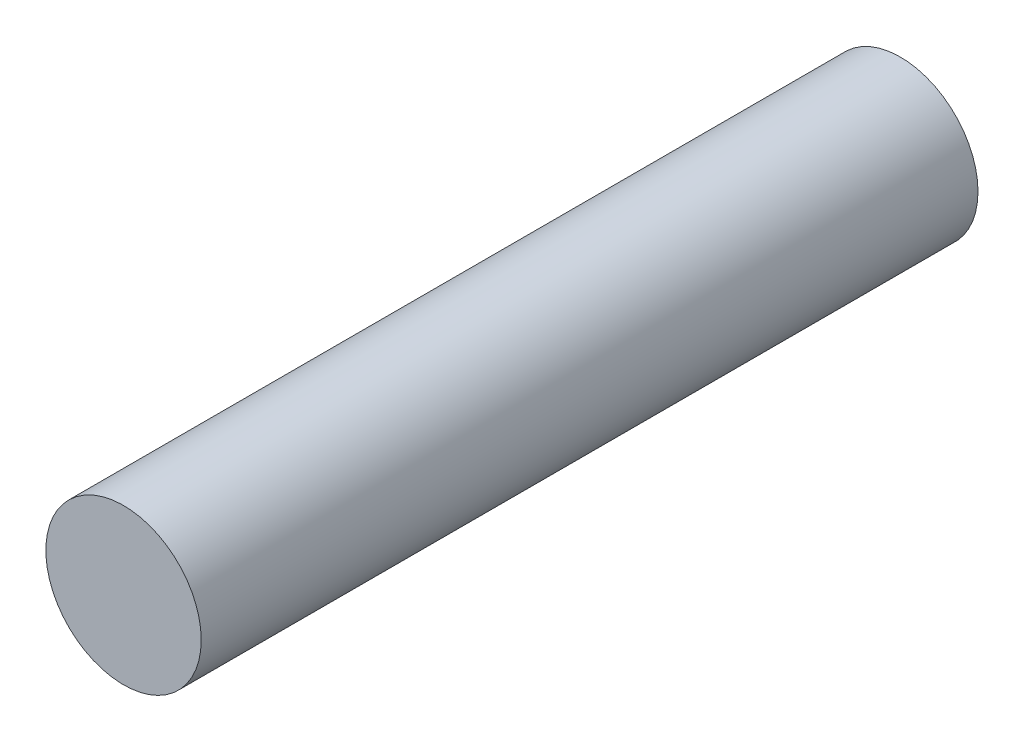
ISO-10303-21;
HEADER;
FILE_DESCRIPTION(('STEP AP214'),'2;1');
FILE_NAME('part.step','',(''),(''),'','','');
FILE_SCHEMA(('AUTOMOTIVE_DESIGN { 1 0 10303 214 1 1 1 1 }'));
ENDSEC;
DATA;
#1=APPLICATION_CONTEXT('core data for automotive mechanical design processes');
#2=APPLICATION_PROTOCOL_DEFINITION('international standard','automotive_design',2000,#1);
#3=PRODUCT_CONTEXT('',#1,'mechanical');
#4=PRODUCT('Part','Part','',(#3));
#5=PRODUCT_RELATED_PRODUCT_CATEGORY('part','',(#4));
#6=PRODUCT_DEFINITION_FORMATION('','',#4);
#7=PRODUCT_DEFINITION_CONTEXT('part definition',#1,'design');
#8=PRODUCT_DEFINITION('design','',#6,#7);
#9=PRODUCT_DEFINITION_SHAPE('','',#8);
#10=(LENGTH_UNIT() NAMED_UNIT(*) SI_UNIT(.MILLI.,.METRE.));
#11=(NAMED_UNIT(*) PLANE_ANGLE_UNIT() SI_UNIT($,.RADIAN.));
#12=(NAMED_UNIT(*) SI_UNIT($,.STERADIAN.) SOLID_ANGLE_UNIT());
#13=UNCERTAINTY_MEASURE_WITH_UNIT(LENGTH_MEASURE(1.E-05),#10,'distance_accuracy_value','');
#14=(GEOMETRIC_REPRESENTATION_CONTEXT(3) GLOBAL_UNCERTAINTY_ASSIGNED_CONTEXT((#13)) GLOBAL_UNIT_ASSIGNED_CONTEXT((#10,
#11,#12)) REPRESENTATION_CONTEXT('',''));
#15=CARTESIAN_POINT('',(0.,0.,0.));
#16=DIRECTION('',(0.,0.,1.));
#17=DIRECTION('',(1.,0.,0.));
#18=AXIS2_PLACEMENT_3D('',#15,#16,#17);
#19=CARTESIAN_POINT('',(0.,0.,75.));
#20=DIRECTION('',(0.,0.,-1.));
#21=DIRECTION('',(-1.,0.,0.));
#22=AXIS2_PLACEMENT_3D('',#19,#20,#21);
#23=CYLINDRICAL_SURFACE('',#22,7.5);
#24=CARTESIAN_POINT('',(0.,0.,75.));
#25=DIRECTION('',(0.,0.,1.));
#26=DIRECTION('',(1.,0.,0.));
#27=AXIS2_PLACEMENT_3D('',#24,#25,#26);
#28=CIRCLE('',#27,7.5);
#29=CARTESIAN_POINT('',(7.5,0.,75.));
#30=VERTEX_POINT('',#29);
#31=EDGE_CURVE('E10',#30,#30,#28,.T.);
#32=ORIENTED_EDGE('',*,*,#31,.F.);
#33=EDGE_LOOP('',(#32));
#34=FACE_BOUND('',#33,.T.);
#35=CARTESIAN_POINT('',(0.,0.,0.));
#36=DIRECTION('',(0.,0.,1.));
#37=DIRECTION('',(1.,0.,0.));
#38=AXIS2_PLACEMENT_3D('',#35,#36,#37);
#39=CIRCLE('',#38,7.5);
#40=CARTESIAN_POINT('',(7.5,0.,0.));
#41=VERTEX_POINT('',#40);
#42=EDGE_CURVE('E37',#41,#41,#39,.T.);
#43=ORIENTED_EDGE('',*,*,#42,.T.);
#44=EDGE_LOOP('',(#43));
#45=FACE_BOUND('',#44,.T.);
#46=ADVANCED_FACE('F34',(#34,#45),#23,.T.);
#47=CARTESIAN_POINT('',(0.,0.,75.));
#48=DIRECTION('',(0.,0.,1.));
#49=DIRECTION('',(1.,0.,0.));
#50=AXIS2_PLACEMENT_3D('',#47,#48,#49);
#51=PLANE('',#50);
#52=ORIENTED_EDGE('',*,*,#31,.T.);
#53=EDGE_LOOP('',(#52));
#54=FACE_BOUND('',#53,.T.);
#55=ADVANCED_FACE('F49',(#54),#51,.T.);
#56=CARTESIAN_POINT('',(0.,0.,0.));
#57=DIRECTION('',(0.,0.,1.));
#58=DIRECTION('',(1.,0.,0.));
#59=AXIS2_PLACEMENT_3D('',#56,#57,#58);
#60=PLANE('',#59);
#61=ORIENTED_EDGE('',*,*,#42,.F.);
#62=EDGE_LOOP('',(#61));
#63=FACE_BOUND('',#62,.T.);
#64=ADVANCED_FACE('F47',(#63),#60,.F.);
#65=CLOSED_SHELL('',(#46,#55,#64));
#66=MANIFOLD_SOLID_BREP('B2',#65);
#67=ADVANCED_BREP_SHAPE_REPRESENTATION('',(#18,#66),#14);
#68=SHAPE_DEFINITION_REPRESENTATION(#9,#67);
ENDSEC;
END-ISO-10303-21;
